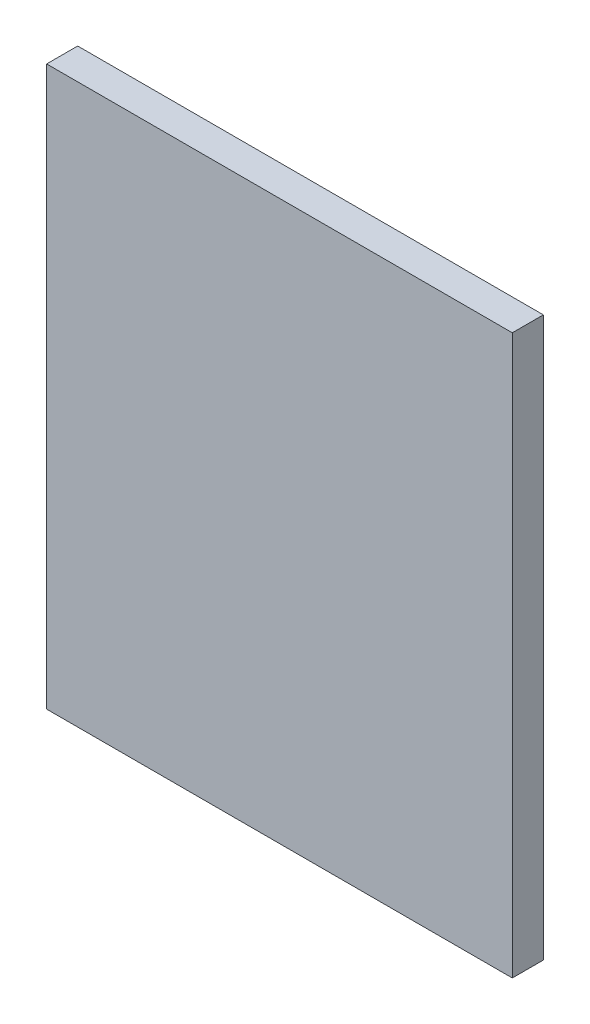
ISO-10303-21;
HEADER;
FILE_DESCRIPTION(('STEP AP214'),'2;1');
FILE_NAME('part.step','',(''),(''),'','','');
FILE_SCHEMA(('AUTOMOTIVE_DESIGN { 1 0 10303 214 1 1 1 1 }'));
ENDSEC;
DATA;
#1=APPLICATION_CONTEXT('core data for automotive mechanical design processes');
#2=APPLICATION_PROTOCOL_DEFINITION('international standard','automotive_design',2000,#1);
#3=PRODUCT_CONTEXT('',#1,'mechanical');
#4=PRODUCT('Part','Part','',(#3));
#5=PRODUCT_RELATED_PRODUCT_CATEGORY('part','',(#4));
#6=PRODUCT_DEFINITION_FORMATION('','',#4);
#7=PRODUCT_DEFINITION_CONTEXT('part definition',#1,'design');
#8=PRODUCT_DEFINITION('design','',#6,#7);
#9=PRODUCT_DEFINITION_SHAPE('','',#8);
#10=(LENGTH_UNIT() NAMED_UNIT(*) SI_UNIT(.MILLI.,.METRE.));
#11=(NAMED_UNIT(*) PLANE_ANGLE_UNIT() SI_UNIT($,.RADIAN.));
#12=(NAMED_UNIT(*) SI_UNIT($,.STERADIAN.) SOLID_ANGLE_UNIT());
#13=UNCERTAINTY_MEASURE_WITH_UNIT(LENGTH_MEASURE(1.E-05),#10,'distance_accuracy_value','');
#14=(GEOMETRIC_REPRESENTATION_CONTEXT(3) GLOBAL_UNCERTAINTY_ASSIGNED_CONTEXT((#13)) GLOBAL_UNIT_ASSIGNED_CONTEXT((#10,
#11,#12)) REPRESENTATION_CONTEXT('',''));
#15=CARTESIAN_POINT('',(0.,0.,0.));
#16=DIRECTION('',(0.,0.,1.));
#17=DIRECTION('',(1.,0.,0.));
#18=AXIS2_PLACEMENT_3D('',#15,#16,#17);
#19=CARTESIAN_POINT('',(-7.5,-9.,0.));
#20=DIRECTION('',(0.,0.,1.));
#21=DIRECTION('',(1.,0.,0.));
#22=AXIS2_PLACEMENT_3D('',#19,#20,#21);
#23=PLANE('',#22);
#24=DIRECTION('',(0.,1.,0.));
#25=VECTOR('',#24,1.);
#26=CARTESIAN_POINT('',(7.5,0.,0.));
#27=LINE('',#26,#25);
#28=CARTESIAN_POINT('',(7.5,-9.,0.));
#29=VERTEX_POINT('',#28);
#30=CARTESIAN_POINT('',(7.5,9.,0.));
#31=VERTEX_POINT('',#30);
#32=EDGE_CURVE('E57',#29,#31,#27,.T.);
#33=ORIENTED_EDGE('',*,*,#32,.F.);
#34=DIRECTION('',(1.,0.,0.));
#35=VECTOR('',#34,1.);
#36=CARTESIAN_POINT('',(0.,-9.,0.));
#37=LINE('',#36,#35);
#38=CARTESIAN_POINT('',(-7.5,-9.,0.));
#39=VERTEX_POINT('',#38);
#40=EDGE_CURVE('E20',#39,#29,#37,.T.);
#41=ORIENTED_EDGE('',*,*,#40,.F.);
#42=DIRECTION('',(0.,-1.,0.));
#43=VECTOR('',#42,1.);
#44=CARTESIAN_POINT('',(-7.5,0.,0.));
#45=LINE('',#44,#43);
#46=CARTESIAN_POINT('',(-7.5,9.,0.));
#47=VERTEX_POINT('',#46);
#48=EDGE_CURVE('E79',#47,#39,#45,.T.);
#49=ORIENTED_EDGE('',*,*,#48,.F.);
#50=DIRECTION('',(-1.,0.,0.));
#51=VECTOR('',#50,1.);
#52=CARTESIAN_POINT('',(0.,9.,0.));
#53=LINE('',#52,#51);
#54=EDGE_CURVE('E55',#31,#47,#53,.T.);
#55=ORIENTED_EDGE('',*,*,#54,.F.);
#56=EDGE_LOOP('',(#33,#41,#49,#55));
#57=FACE_BOUND('',#56,.T.);
#58=ADVANCED_FACE('F16',(#57),#23,.F.);
#59=CARTESIAN_POINT('',(-7.5,-9.,1.));
#60=DIRECTION('',(0.,-1.,0.));
#61=DIRECTION('',(0.,0.,-1.));
#62=AXIS2_PLACEMENT_3D('',#59,#60,#61);
#63=PLANE('',#62);
#64=DIRECTION('',(1.,0.,0.));
#65=VECTOR('',#64,1.);
#66=CARTESIAN_POINT('',(0.,-9.,1.));
#67=LINE('',#66,#65);
#68=CARTESIAN_POINT('',(-7.5,-9.,1.));
#69=VERTEX_POINT('',#68);
#70=CARTESIAN_POINT('',(7.5,-9.,1.));
#71=VERTEX_POINT('',#70);
#72=EDGE_CURVE('E83',#69,#71,#67,.T.);
#73=ORIENTED_EDGE('',*,*,#72,.F.);
#74=DIRECTION('',(0.,0.,1.));
#75=VECTOR('',#74,1.);
#76=CARTESIAN_POINT('',(-7.5,-9.,0.5));
#77=LINE('',#76,#75);
#78=EDGE_CURVE('E68',#39,#69,#77,.T.);
#79=ORIENTED_EDGE('',*,*,#78,.F.);
#80=ORIENTED_EDGE('',*,*,#40,.T.);
#81=DIRECTION('',(0.,0.,-1.));
#82=VECTOR('',#81,1.);
#83=CARTESIAN_POINT('',(7.5,-9.,0.5));
#84=LINE('',#83,#82);
#85=EDGE_CURVE('E63',#71,#29,#84,.T.);
#86=ORIENTED_EDGE('',*,*,#85,.F.);
#87=EDGE_LOOP('',(#73,#79,#80,#86));
#88=FACE_BOUND('',#87,.T.);
#89=ADVANCED_FACE('F65',(#88),#63,.T.);
#90=CARTESIAN_POINT('',(7.5,-9.,1.));
#91=DIRECTION('',(1.,0.,0.));
#92=DIRECTION('',(0.,0.,-1.));
#93=AXIS2_PLACEMENT_3D('',#90,#91,#92);
#94=PLANE('',#93);
#95=DIRECTION('',(0.,1.,0.));
#96=VECTOR('',#95,1.);
#97=CARTESIAN_POINT('',(7.5,0.,1.));
#98=LINE('',#97,#96);
#99=CARTESIAN_POINT('',(7.5,9.,1.));
#100=VERTEX_POINT('',#99);
#101=EDGE_CURVE('E72',#71,#100,#98,.T.);
#102=ORIENTED_EDGE('',*,*,#101,.F.);
#103=ORIENTED_EDGE('',*,*,#85,.T.);
#104=ORIENTED_EDGE('',*,*,#32,.T.);
#105=DIRECTION('',(0.,0.,-1.));
#106=VECTOR('',#105,1.);
#107=CARTESIAN_POINT('',(7.5,9.,0.5));
#108=LINE('',#107,#106);
#109=EDGE_CURVE('E75',#100,#31,#108,.T.);
#110=ORIENTED_EDGE('',*,*,#109,.F.);
#111=EDGE_LOOP('',(#102,#103,#104,#110));
#112=FACE_BOUND('',#111,.T.);
#113=ADVANCED_FACE('F70',(#112),#94,.T.);
#114=CARTESIAN_POINT('',(-7.5,9.,0.));
#115=DIRECTION('',(0.,1.,0.));
#116=DIRECTION('',(0.,0.,1.));
#117=AXIS2_PLACEMENT_3D('',#114,#115,#116);
#118=PLANE('',#117);
#119=DIRECTION('',(-1.,0.,0.));
#120=VECTOR('',#119,1.);
#121=CARTESIAN_POINT('',(0.,9.,1.));
#122=LINE('',#121,#120);
#123=CARTESIAN_POINT('',(-7.5,9.,1.));
#124=VERTEX_POINT('',#123);
#125=EDGE_CURVE('E26',#100,#124,#122,.T.);
#126=ORIENTED_EDGE('',*,*,#125,.F.);
#127=ORIENTED_EDGE('',*,*,#109,.T.);
#128=ORIENTED_EDGE('',*,*,#54,.T.);
#129=DIRECTION('',(0.,0.,-1.));
#130=VECTOR('',#129,1.);
#131=CARTESIAN_POINT('',(-7.5,9.,0.5));
#132=LINE('',#131,#130);
#133=EDGE_CURVE('E35',#124,#47,#132,.T.);
#134=ORIENTED_EDGE('',*,*,#133,.F.);
#135=EDGE_LOOP('',(#126,#127,#128,#134));
#136=FACE_BOUND('',#135,.T.);
#137=ADVANCED_FACE('F88',(#136),#118,.T.);
#138=CARTESIAN_POINT('',(-7.5,-9.,0.));
#139=DIRECTION('',(-1.,0.,0.));
#140=DIRECTION('',(0.,0.,1.));
#141=AXIS2_PLACEMENT_3D('',#138,#139,#140);
#142=PLANE('',#141);
#143=DIRECTION('',(0.,-1.,0.));
#144=VECTOR('',#143,1.);
#145=CARTESIAN_POINT('',(-7.5,0.,1.));
#146=LINE('',#145,#144);
#147=EDGE_CURVE('E11',#124,#69,#146,.T.);
#148=ORIENTED_EDGE('',*,*,#147,.F.);
#149=ORIENTED_EDGE('',*,*,#133,.T.);
#150=ORIENTED_EDGE('',*,*,#48,.T.);
#151=ORIENTED_EDGE('',*,*,#78,.T.);
#152=EDGE_LOOP('',(#148,#149,#150,#151));
#153=FACE_BOUND('',#152,.T.);
#154=ADVANCED_FACE('F90',(#153),#142,.T.);
#155=CARTESIAN_POINT('',(-7.5,-9.,1.));
#156=DIRECTION('',(0.,0.,1.));
#157=DIRECTION('',(1.,0.,0.));
#158=AXIS2_PLACEMENT_3D('',#155,#156,#157);
#159=PLANE('',#158);
#160=ORIENTED_EDGE('',*,*,#125,.T.);
#161=ORIENTED_EDGE('',*,*,#147,.T.);
#162=ORIENTED_EDGE('',*,*,#72,.T.);
#163=ORIENTED_EDGE('',*,*,#101,.T.);
#164=EDGE_LOOP('',(#160,#161,#162,#163));
#165=FACE_BOUND('',#164,.T.);
#166=ADVANCED_FACE('F18',(#165),#159,.T.);
#167=CLOSED_SHELL('',(#58,#89,#113,#137,#154,#166));
#168=MANIFOLD_SOLID_BREP('B1',#167);
#169=ADVANCED_BREP_SHAPE_REPRESENTATION('',(#18,#168),#14);
#170=SHAPE_DEFINITION_REPRESENTATION(#9,#169);
ENDSEC;
END-ISO-10303-21;
